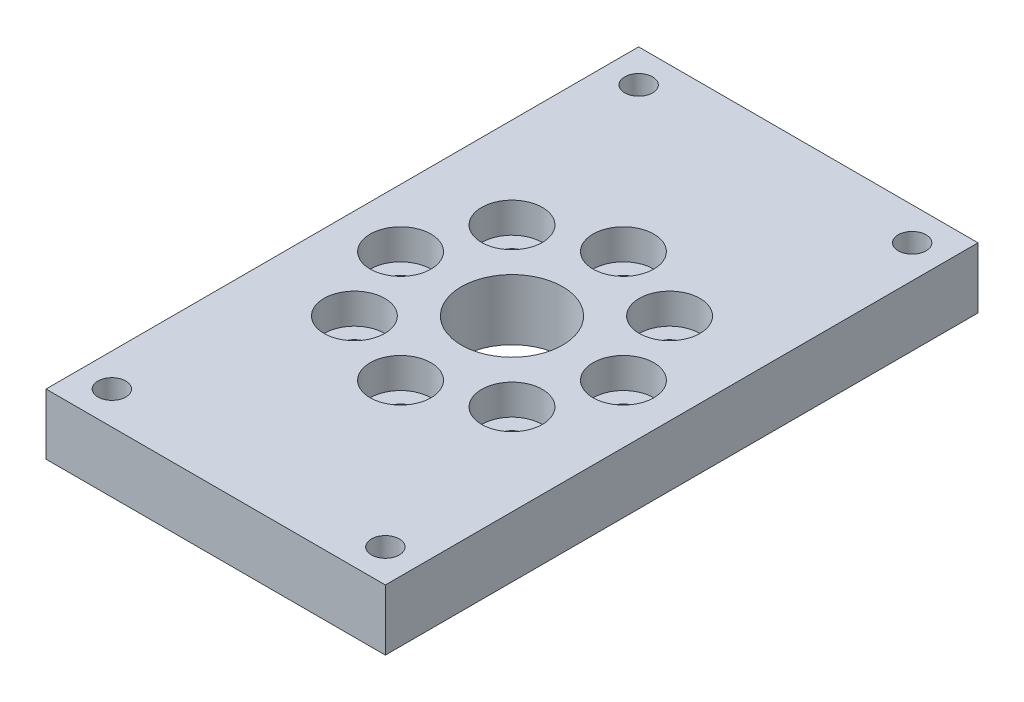
ISO-10303-21;
HEADER;
FILE_DESCRIPTION(('STEP AP214'),'2;1');
FILE_NAME('part.step','',(''),(''),'','','');
FILE_SCHEMA(('AUTOMOTIVE_DESIGN { 1 0 10303 214 1 1 1 1 }'));
ENDSEC;
DATA;
#1=APPLICATION_CONTEXT('core data for automotive mechanical design processes');
#2=APPLICATION_PROTOCOL_DEFINITION('international standard','automotive_design',2000,#1);
#3=PRODUCT_CONTEXT('',#1,'mechanical');
#4=PRODUCT('Part','Part','',(#3));
#5=PRODUCT_RELATED_PRODUCT_CATEGORY('part','',(#4));
#6=PRODUCT_DEFINITION_FORMATION('','',#4);
#7=PRODUCT_DEFINITION_CONTEXT('part definition',#1,'design');
#8=PRODUCT_DEFINITION('design','',#6,#7);
#9=PRODUCT_DEFINITION_SHAPE('','',#8);
#10=(LENGTH_UNIT() NAMED_UNIT(*) SI_UNIT(.MILLI.,.METRE.));
#11=(NAMED_UNIT(*) PLANE_ANGLE_UNIT() SI_UNIT($,.RADIAN.));
#12=(NAMED_UNIT(*) SI_UNIT($,.STERADIAN.) SOLID_ANGLE_UNIT());
#13=UNCERTAINTY_MEASURE_WITH_UNIT(LENGTH_MEASURE(1.E-05),#10,'distance_accuracy_value','');
#14=(GEOMETRIC_REPRESENTATION_CONTEXT(3) GLOBAL_UNCERTAINTY_ASSIGNED_CONTEXT((#13)) GLOBAL_UNIT_ASSIGNED_CONTEXT((#10,
#11,#12)) REPRESENTATION_CONTEXT('',''));
#15=CARTESIAN_POINT('',(0.,0.,0.));
#16=DIRECTION('',(0.,0.,1.));
#17=DIRECTION('',(1.,0.,0.));
#18=AXIS2_PLACEMENT_3D('',#15,#16,#17);
#19=CARTESIAN_POINT('',(13.5,5.99999999999995,-26.));
#20=DIRECTION('',(0.,-1.,0.));
#21=DIRECTION('',(1.,0.,0.));
#22=AXIS2_PLACEMENT_3D('',#19,#20,#21);
#23=CYLINDRICAL_SURFACE('',#22,1.375);
#24=CARTESIAN_POINT('',(13.5,5.99999999999995,-26.));
#25=DIRECTION('',(0.,1.,0.));
#26=DIRECTION('',(-1.,0.,0.));
#27=AXIS2_PLACEMENT_3D('',#24,#25,#26);
#28=CIRCLE('',#27,1.375);
#29=CARTESIAN_POINT('',(12.125,5.99999999999996,-26.));
#30=VERTEX_POINT('',#29);
#31=EDGE_CURVE('E118',#30,#30,#28,.T.);
#32=ORIENTED_EDGE('',*,*,#31,.T.);
#33=EDGE_LOOP('',(#32));
#34=FACE_BOUND('',#33,.T.);
#35=CARTESIAN_POINT('',(13.5,2.99999999999995,-26.));
#36=DIRECTION('',(0.,-1.,0.));
#37=DIRECTION('',(1.,0.,0.));
#38=AXIS2_PLACEMENT_3D('',#35,#36,#37);
#39=CIRCLE('',#38,1.375);
#40=CARTESIAN_POINT('',(14.875,2.99999999999995,-26.));
#41=VERTEX_POINT('',#40);
#42=EDGE_CURVE('E45',#41,#41,#39,.T.);
#43=ORIENTED_EDGE('',*,*,#42,.T.);
#44=EDGE_LOOP('',(#43));
#45=FACE_BOUND('',#44,.T.);
#46=ADVANCED_FACE('F41',(#34,#45),#23,.F.);
#47=CARTESIAN_POINT('',(-13.5,6.00000000000005,-26.));
#48=DIRECTION('',(0.,-1.,0.));
#49=DIRECTION('',(1.,0.,0.));
#50=AXIS2_PLACEMENT_3D('',#47,#48,#49);
#51=CYLINDRICAL_SURFACE('',#50,1.375);
#52=CARTESIAN_POINT('',(-13.5,6.00000000000005,-26.));
#53=DIRECTION('',(0.,1.,0.));
#54=DIRECTION('',(-1.,0.,0.));
#55=AXIS2_PLACEMENT_3D('',#52,#53,#54);
#56=CIRCLE('',#55,1.375);
#57=CARTESIAN_POINT('',(-14.875,6.00000000000005,-26.));
#58=VERTEX_POINT('',#57);
#59=EDGE_CURVE('E280',#58,#58,#56,.T.);
#60=ORIENTED_EDGE('',*,*,#59,.T.);
#61=EDGE_LOOP('',(#60));
#62=FACE_BOUND('',#61,.T.);
#63=CARTESIAN_POINT('',(-13.5,3.00000000000005,-26.));
#64=DIRECTION('',(0.,-1.,0.));
#65=DIRECTION('',(1.,0.,0.));
#66=AXIS2_PLACEMENT_3D('',#63,#64,#65);
#67=CIRCLE('',#66,1.375);
#68=CARTESIAN_POINT('',(-12.125,3.00000000000004,-26.));
#69=VERTEX_POINT('',#68);
#70=EDGE_CURVE('E208',#69,#69,#67,.T.);
#71=ORIENTED_EDGE('',*,*,#70,.T.);
#72=EDGE_LOOP('',(#71));
#73=FACE_BOUND('',#72,.T.);
#74=ADVANCED_FACE('F384',(#62,#73),#51,.F.);
#75=CARTESIAN_POINT('',(13.5,5.99999999999995,26.));
#76=DIRECTION('',(0.,-1.,0.));
#77=DIRECTION('',(1.,0.,0.));
#78=AXIS2_PLACEMENT_3D('',#75,#76,#77);
#79=CYLINDRICAL_SURFACE('',#78,1.375);
#80=CARTESIAN_POINT('',(13.5,5.99999999999995,26.));
#81=DIRECTION('',(0.,1.,0.));
#82=DIRECTION('',(-1.,0.,0.));
#83=AXIS2_PLACEMENT_3D('',#80,#81,#82);
#84=CIRCLE('',#83,1.375);
#85=CARTESIAN_POINT('',(12.125,5.99999999999996,26.));
#86=VERTEX_POINT('',#85);
#87=EDGE_CURVE('E276',#86,#86,#84,.T.);
#88=ORIENTED_EDGE('',*,*,#87,.T.);
#89=EDGE_LOOP('',(#88));
#90=FACE_BOUND('',#89,.T.);
#91=CARTESIAN_POINT('',(13.5,2.99999999999995,26.));
#92=DIRECTION('',(0.,-1.,0.));
#93=DIRECTION('',(1.,0.,0.));
#94=AXIS2_PLACEMENT_3D('',#91,#92,#93);
#95=CIRCLE('',#94,1.375);
#96=CARTESIAN_POINT('',(14.875,2.99999999999995,26.));
#97=VERTEX_POINT('',#96);
#98=EDGE_CURVE('E204',#97,#97,#95,.T.);
#99=ORIENTED_EDGE('',*,*,#98,.T.);
#100=EDGE_LOOP('',(#99));
#101=FACE_BOUND('',#100,.T.);
#102=ADVANCED_FACE('F390',(#90,#101),#79,.F.);
#103=CARTESIAN_POINT('',(-13.5,6.00000000000005,26.));
#104=DIRECTION('',(0.,-1.,0.));
#105=DIRECTION('',(1.,0.,0.));
#106=AXIS2_PLACEMENT_3D('',#103,#104,#105);
#107=CYLINDRICAL_SURFACE('',#106,1.375);
#108=CARTESIAN_POINT('',(-13.5,6.00000000000005,26.));
#109=DIRECTION('',(0.,1.,0.));
#110=DIRECTION('',(-1.,0.,0.));
#111=AXIS2_PLACEMENT_3D('',#108,#109,#110);
#112=CIRCLE('',#111,1.375);
#113=CARTESIAN_POINT('',(-14.875,6.00000000000005,26.));
#114=VERTEX_POINT('',#113);
#115=EDGE_CURVE('E162',#114,#114,#112,.T.);
#116=ORIENTED_EDGE('',*,*,#115,.T.);
#117=EDGE_LOOP('',(#116));
#118=FACE_BOUND('',#117,.T.);
#119=CARTESIAN_POINT('',(-13.5,3.00000000000005,26.));
#120=DIRECTION('',(0.,-1.,0.));
#121=DIRECTION('',(1.,0.,0.));
#122=AXIS2_PLACEMENT_3D('',#119,#120,#121);
#123=CIRCLE('',#122,1.375);
#124=CARTESIAN_POINT('',(-12.125,3.00000000000004,26.));
#125=VERTEX_POINT('',#124);
#126=EDGE_CURVE('E200',#125,#125,#123,.T.);
#127=ORIENTED_EDGE('',*,*,#126,.T.);
#128=EDGE_LOOP('',(#127));
#129=FACE_BOUND('',#128,.T.);
#130=ADVANCED_FACE('F426',(#118,#129),#107,.F.);
#131=CARTESIAN_POINT('',(7.77817459305207,-13.,-7.77817459305192));
#132=DIRECTION('',(0.,1.,0.));
#133=DIRECTION('',(-1.,0.,0.));
#134=AXIS2_PLACEMENT_3D('',#131,#132,#133);
#135=CYLINDRICAL_SURFACE('',#134,1.375);
#136=CARTESIAN_POINT('',(7.77817459305211,0.,-7.77817459305192));
#137=DIRECTION('',(0.,1.,0.));
#138=DIRECTION('',(-1.,0.,0.));
#139=AXIS2_PLACEMENT_3D('',#136,#137,#138);
#140=CIRCLE('',#139,1.375);
#141=CARTESIAN_POINT('',(6.40317459305211,0.,-7.77817459305192));
#142=VERTEX_POINT('',#141);
#143=EDGE_CURVE('E129',#142,#142,#140,.T.);
#144=ORIENTED_EDGE('',*,*,#143,.F.);
#145=EDGE_LOOP('',(#144));
#146=FACE_BOUND('',#145,.T.);
#147=CARTESIAN_POINT('',(7.77817459305213,2.99999999999997,-7.77817459305192));
#148=DIRECTION('',(0.,1.,0.));
#149=DIRECTION('',(-1.,0.,0.));
#150=AXIS2_PLACEMENT_3D('',#147,#148,#149);
#151=CIRCLE('',#150,1.375);
#152=CARTESIAN_POINT('',(6.40317459305212,2.99999999999998,-7.77817459305192));
#153=VERTEX_POINT('',#152);
#154=EDGE_CURVE('E196',#153,#153,#151,.F.);
#155=ORIENTED_EDGE('',*,*,#154,.F.);
#156=EDGE_LOOP('',(#155));
#157=FACE_BOUND('',#156,.T.);
#158=ADVANCED_FACE('F536',(#146,#157),#135,.F.);
#159=CARTESIAN_POINT('',(-5.04302264350436E-13,-13.,-10.9999999999995));
#160=DIRECTION('',(0.,1.,0.));
#161=DIRECTION('',(-1.,0.,0.));
#162=AXIS2_PLACEMENT_3D('',#159,#160,#161);
#163=CYLINDRICAL_SURFACE('',#162,1.37500000000069);
#164=CARTESIAN_POINT('',(-4.58913006945475E-13,0.,-10.9999999999995));
#165=DIRECTION('',(0.,1.,0.));
#166=DIRECTION('',(-1.,0.,0.));
#167=AXIS2_PLACEMENT_3D('',#164,#165,#166);
#168=CIRCLE('',#167,1.37500000000069);
#169=CARTESIAN_POINT('',(-1.37500000000115,0.,-10.9999999999995));
#170=VERTEX_POINT('',#169);
#171=EDGE_CURVE('E133',#170,#170,#168,.T.);
#172=ORIENTED_EDGE('',*,*,#171,.F.);
#173=EDGE_LOOP('',(#172));
#174=FACE_BOUND('',#173,.T.);
#175=CARTESIAN_POINT('',(-4.48438562928946E-13,3.,-10.9999999999995));
#176=DIRECTION('',(0.,1.,0.));
#177=DIRECTION('',(-1.,0.,0.));
#178=AXIS2_PLACEMENT_3D('',#175,#176,#177);
#179=CIRCLE('',#178,1.37500000000069);
#180=CARTESIAN_POINT('',(-1.37500000000113,3.00000000000001,-10.9999999999995));
#181=VERTEX_POINT('',#180);
#182=EDGE_CURVE('E192',#181,#181,#179,.F.);
#183=ORIENTED_EDGE('',*,*,#182,.F.);
#184=EDGE_LOOP('',(#183));
#185=FACE_BOUND('',#184,.T.);
#186=ADVANCED_FACE('F533',(#174,#185),#163,.F.);
#187=CARTESIAN_POINT('',(-7.77817459305239,-13.,-7.77817459305125));
#188=DIRECTION('',(0.,1.,0.));
#189=DIRECTION('',(-1.,0.,0.));
#190=AXIS2_PLACEMENT_3D('',#187,#188,#189);
#191=CYLINDRICAL_SURFACE('',#190,1.37500000000094);
#192=CARTESIAN_POINT('',(-7.77817459305235,0.,-7.77817459305125));
#193=DIRECTION('',(0.,1.,0.));
#194=DIRECTION('',(-1.,0.,0.));
#195=AXIS2_PLACEMENT_3D('',#192,#193,#194);
#196=CIRCLE('',#195,1.37500000000094);
#197=CARTESIAN_POINT('',(-9.15317459305329,0.,-7.77817459305125));
#198=VERTEX_POINT('',#197);
#199=EDGE_CURVE('E138',#198,#198,#196,.T.);
#200=ORIENTED_EDGE('',*,*,#199,.F.);
#201=EDGE_LOOP('',(#200));
#202=FACE_BOUND('',#201,.T.);
#203=CARTESIAN_POINT('',(-7.77817459305234,3.00000000000003,-7.77817459305125));
#204=DIRECTION('',(0.,1.,0.));
#205=DIRECTION('',(-1.,0.,0.));
#206=AXIS2_PLACEMENT_3D('',#203,#204,#205);
#207=CIRCLE('',#206,1.37500000000094);
#208=CARTESIAN_POINT('',(-9.15317459305328,3.00000000000003,-7.77817459305125));
#209=VERTEX_POINT('',#208);
#210=EDGE_CURVE('E188',#209,#209,#207,.F.);
#211=ORIENTED_EDGE('',*,*,#210,.F.);
#212=EDGE_LOOP('',(#211));
#213=FACE_BOUND('',#212,.T.);
#214=ADVANCED_FACE('F529',(#202,#213),#191,.F.);
#215=CARTESIAN_POINT('',(-11.0000000000001,-13.,9.0726037793587E-13));
#216=DIRECTION('',(0.,1.,0.));
#217=DIRECTION('',(-1.,0.,0.));
#218=AXIS2_PLACEMENT_3D('',#215,#216,#217);
#219=CYLINDRICAL_SURFACE('',#218,1.37500000000096);
#220=CARTESIAN_POINT('',(-11.,0.,9.07694058804864E-13));
#221=DIRECTION('',(0.,1.,0.));
#222=DIRECTION('',(-1.,0.,0.));
#223=AXIS2_PLACEMENT_3D('',#220,#221,#222);
#224=CIRCLE('',#223,1.37500000000096);
#225=CARTESIAN_POINT('',(-12.375000000001,0.,9.07694058804864E-13));
#226=VERTEX_POINT('',#225);
#227=EDGE_CURVE('E142',#226,#226,#224,.T.);
#228=ORIENTED_EDGE('',*,*,#227,.F.);
#229=EDGE_LOOP('',(#228));
#230=FACE_BOUND('',#229,.T.);
#231=CARTESIAN_POINT('',(-11.,3.00000000000004,9.0726037793587E-13));
#232=DIRECTION('',(0.,1.,0.));
#233=DIRECTION('',(-1.,0.,0.));
#234=AXIS2_PLACEMENT_3D('',#231,#232,#233);
#235=CIRCLE('',#234,1.37500000000096);
#236=CARTESIAN_POINT('',(-12.375000000001,3.00000000000005,9.0726037793587E-13));
#237=VERTEX_POINT('',#236);
#238=EDGE_CURVE('E184',#237,#237,#235,.F.);
#239=ORIENTED_EDGE('',*,*,#238,.F.);
#240=EDGE_LOOP('',(#239));
#241=FACE_BOUND('',#240,.T.);
#242=ADVANCED_FACE('F525',(#230,#241),#219,.F.);
#243=CARTESIAN_POINT('',(-7.77817459305176,-13.,7.7781745930528));
#244=DIRECTION('',(0.,1.,0.));
#245=DIRECTION('',(-1.,0.,0.));
#246=AXIS2_PLACEMENT_3D('',#243,#244,#245);
#247=CYLINDRICAL_SURFACE('',#246,1.37500000000071);
#248=CARTESIAN_POINT('',(-7.77817459305172,0.,7.7781745930528));
#249=DIRECTION('',(0.,1.,0.));
#250=DIRECTION('',(-1.,0.,0.));
#251=AXIS2_PLACEMENT_3D('',#248,#249,#250);
#252=CIRCLE('',#251,1.37500000000071);
#253=CARTESIAN_POINT('',(-9.15317459305243,0.,7.7781745930528));
#254=VERTEX_POINT('',#253);
#255=EDGE_CURVE('E146',#254,#254,#252,.T.);
#256=ORIENTED_EDGE('',*,*,#255,.F.);
#257=EDGE_LOOP('',(#256));
#258=FACE_BOUND('',#257,.T.);
#259=CARTESIAN_POINT('',(-7.77817459305171,3.00000000000003,7.7781745930528));
#260=DIRECTION('',(0.,1.,0.));
#261=DIRECTION('',(-1.,0.,0.));
#262=AXIS2_PLACEMENT_3D('',#259,#260,#261);
#263=CIRCLE('',#262,1.37500000000071);
#264=CARTESIAN_POINT('',(-9.15317459305242,3.00000000000003,7.7781745930528));
#265=VERTEX_POINT('',#264);
#266=EDGE_CURVE('E180',#265,#265,#263,.F.);
#267=ORIENTED_EDGE('',*,*,#266,.F.);
#268=EDGE_LOOP('',(#267));
#269=FACE_BOUND('',#268,.T.);
#270=ADVANCED_FACE('F528',(#258,#269),#247,.F.);
#271=CARTESIAN_POINT('',(3.91227750028394E-13,-13.,11.0000000000005));
#272=DIRECTION('',(0.,1.,0.));
#273=DIRECTION('',(-1.,0.,0.));
#274=AXIS2_PLACEMENT_3D('',#271,#272,#273);
#275=CYLINDRICAL_SURFACE('',#274,1.37500000000034);
#276=CARTESIAN_POINT('',(4.36617007433354E-13,0.,11.0000000000005));
#277=DIRECTION('',(0.,1.,0.));
#278=DIRECTION('',(-1.,0.,0.));
#279=AXIS2_PLACEMENT_3D('',#276,#277,#278);
#280=CIRCLE('',#279,1.37500000000034);
#281=CARTESIAN_POINT('',(-1.37499999999991,0.,11.0000000000005));
#282=VERTEX_POINT('',#281);
#283=EDGE_CURVE('E150',#282,#282,#280,.T.);
#284=ORIENTED_EDGE('',*,*,#283,.F.);
#285=EDGE_LOOP('',(#284));
#286=FACE_BOUND('',#285,.T.);
#287=CARTESIAN_POINT('',(4.47091451449884E-13,3.,11.0000000000005));
#288=DIRECTION('',(0.,1.,0.));
#289=DIRECTION('',(-1.,0.,0.));
#290=AXIS2_PLACEMENT_3D('',#287,#288,#289);
#291=CIRCLE('',#290,1.37500000000034);
#292=CARTESIAN_POINT('',(-1.3749999999999,3.00000000000001,11.0000000000005));
#293=VERTEX_POINT('',#292);
#294=EDGE_CURVE('E176',#293,#293,#291,.F.);
#295=ORIENTED_EDGE('',*,*,#294,.F.);
#296=EDGE_LOOP('',(#295));
#297=FACE_BOUND('',#296,.T.);
#298=ADVANCED_FACE('F541',(#286,#297),#275,.F.);
#299=CARTESIAN_POINT('',(7.77817459305194,-13.,7.77817459305205));
#300=DIRECTION('',(0.,1.,0.));
#301=DIRECTION('',(-1.,0.,0.));
#302=AXIS2_PLACEMENT_3D('',#299,#300,#301);
#303=CYLINDRICAL_SURFACE('',#302,1.375);
#304=CARTESIAN_POINT('',(7.77817459305199,0.,7.77817459305205));
#305=DIRECTION('',(0.,1.,0.));
#306=DIRECTION('',(-1.,0.,0.));
#307=AXIS2_PLACEMENT_3D('',#304,#305,#306);
#308=CIRCLE('',#307,1.375);
#309=CARTESIAN_POINT('',(6.40317459305199,0.,7.77817459305205));
#310=VERTEX_POINT('',#309);
#311=EDGE_CURVE('E154',#310,#310,#308,.T.);
#312=ORIENTED_EDGE('',*,*,#311,.F.);
#313=EDGE_LOOP('',(#312));
#314=FACE_BOUND('',#313,.T.);
#315=CARTESIAN_POINT('',(7.778174593052,2.99999999999997,7.77817459305205));
#316=DIRECTION('',(0.,1.,0.));
#317=DIRECTION('',(-1.,0.,0.));
#318=AXIS2_PLACEMENT_3D('',#315,#316,#317);
#319=CIRCLE('',#318,1.375);
#320=CARTESIAN_POINT('',(6.403174593052,2.99999999999998,7.77817459305205));
#321=VERTEX_POINT('',#320);
#322=EDGE_CURVE('E171',#321,#321,#319,.F.);
#323=ORIENTED_EDGE('',*,*,#322,.F.);
#324=EDGE_LOOP('',(#323));
#325=FACE_BOUND('',#324,.T.);
#326=ADVANCED_FACE('F401',(#314,#325),#303,.F.);
#327=CARTESIAN_POINT('',(10.9999999999999,-13.,0.));
#328=DIRECTION('',(0.,1.,0.));
#329=DIRECTION('',(-1.,0.,0.));
#330=AXIS2_PLACEMENT_3D('',#327,#328,#329);
#331=CYLINDRICAL_SURFACE('',#330,1.375);
#332=CARTESIAN_POINT('',(11.,0.,0.));
#333=DIRECTION('',(0.,1.,0.));
#334=DIRECTION('',(-1.,0.,0.));
#335=AXIS2_PLACEMENT_3D('',#332,#333,#334);
#336=CIRCLE('',#335,1.375);
#337=CARTESIAN_POINT('',(9.62499999999999,0.,0.));
#338=VERTEX_POINT('',#337);
#339=EDGE_CURVE('E158',#338,#338,#336,.T.);
#340=ORIENTED_EDGE('',*,*,#339,.F.);
#341=EDGE_LOOP('',(#340));
#342=FACE_BOUND('',#341,.T.);
#343=CARTESIAN_POINT('',(11.,2.99999999999996,0.));
#344=DIRECTION('',(0.,1.,0.));
#345=DIRECTION('',(-1.,0.,0.));
#346=AXIS2_PLACEMENT_3D('',#343,#344,#345);
#347=CIRCLE('',#346,1.375);
#348=CARTESIAN_POINT('',(9.625,2.99999999999997,0.));
#349=VERTEX_POINT('',#348);
#350=EDGE_CURVE('E167',#349,#349,#347,.F.);
#351=ORIENTED_EDGE('',*,*,#350,.F.);
#352=EDGE_LOOP('',(#351));
#353=FACE_BOUND('',#352,.T.);
#354=ADVANCED_FACE('F396',(#342,#353),#331,.F.);
#355=CARTESIAN_POINT('',(0.,6.,0.));
#356=DIRECTION('',(0.,1.,0.));
#357=DIRECTION('',(-1.,0.,0.));
#358=AXIS2_PLACEMENT_3D('',#355,#356,#357);
#359=PLANE('',#358);
#360=CARTESIAN_POINT('',(11.0000000000003,5.99999999999996,0.));
#361=DIRECTION('',(0.,1.,0.));
#362=DIRECTION('',(-1.,0.,0.));
#363=AXIS2_PLACEMENT_3D('',#360,#361,#362);
#364=CIRCLE('',#363,3.00000000000029);
#365=CARTESIAN_POINT('',(8.00000000000004,5.99999999999997,0.));
#366=VERTEX_POINT('',#365);
#367=EDGE_CURVE('E235',#366,#366,#364,.T.);
#368=ORIENTED_EDGE('',*,*,#367,.F.);
#369=EDGE_LOOP('',(#368));
#370=FACE_BOUND('',#369,.T.);
#371=CARTESIAN_POINT('',(7.77817459305259,5.99999999999997,7.77817459305213));
#372=DIRECTION('',(0.,1.,0.));
#373=DIRECTION('',(-1.,0.,0.));
#374=AXIS2_PLACEMENT_3D('',#371,#372,#373);
#375=CIRCLE('',#374,3.00000000000067);
#376=CARTESIAN_POINT('',(4.77817459305192,5.99999999999998,7.77817459305213));
#377=VERTEX_POINT('',#376);
#378=EDGE_CURVE('E243',#377,#377,#375,.T.);
#379=ORIENTED_EDGE('',*,*,#378,.F.);
#380=EDGE_LOOP('',(#379));
#381=FACE_BOUND('',#380,.T.);
#382=CARTESIAN_POINT('',(6.6108964850849E-13,6.,11.0000000000003));
#383=DIRECTION('',(0.,1.,0.));
#384=DIRECTION('',(-1.,0.,0.));
#385=AXIS2_PLACEMENT_3D('',#382,#383,#384);
#386=CIRCLE('',#385,3.00000000000091);
#387=CARTESIAN_POINT('',(-3.00000000000025,6.00000000000001,11.0000000000003));
#388=VERTEX_POINT('',#387);
#389=EDGE_CURVE('E251',#388,#388,#386,.T.);
#390=ORIENTED_EDGE('',*,*,#389,.F.);
#391=EDGE_LOOP('',(#390));
#392=FACE_BOUND('',#391,.T.);
#393=CARTESIAN_POINT('',(-7.77817459305145,6.00000000000003,7.77817459305258));
#394=DIRECTION('',(0.,1.,0.));
#395=DIRECTION('',(-1.,0.,0.));
#396=AXIS2_PLACEMENT_3D('',#393,#394,#395);
#397=CIRCLE('',#396,3.00000000000089);
#398=CARTESIAN_POINT('',(-10.7781745930523,6.00000000000004,7.77817459305258));
#399=VERTEX_POINT('',#398);
#400=EDGE_CURVE('E259',#399,#399,#397,.T.);
#401=ORIENTED_EDGE('',*,*,#400,.F.);
#402=EDGE_LOOP('',(#401));
#403=FACE_BOUND('',#402,.T.);
#404=CARTESIAN_POINT('',(-10.9999999999997,6.00000000000004,6.51388665229291E-13));
#405=DIRECTION('',(0.,1.,0.));
#406=DIRECTION('',(-1.,0.,0.));
#407=AXIS2_PLACEMENT_3D('',#404,#405,#406);
#408=CIRCLE('',#407,3.00000000000064);
#409=CARTESIAN_POINT('',(-14.0000000000003,6.00000000000005,6.51388665229291E-13));
#410=VERTEX_POINT('',#409);
#411=EDGE_CURVE('E290',#410,#410,#408,.T.);
#412=ORIENTED_EDGE('',*,*,#411,.F.);
#413=EDGE_LOOP('',(#412));
#414=FACE_BOUND('',#413,.T.);
#415=CARTESIAN_POINT('',(-7.77817459305191,6.00000000000003,-7.77817459305146));
#416=DIRECTION('',(0.,1.,0.));
#417=DIRECTION('',(-1.,0.,0.));
#418=AXIS2_PLACEMENT_3D('',#415,#416,#417);
#419=CIRCLE('',#418,3.0000000000003);
#420=CARTESIAN_POINT('',(-10.7781745930522,6.00000000000004,-7.77817459305146));
#421=VERTEX_POINT('',#420);
#422=EDGE_CURVE('E226',#421,#421,#419,.T.);
#423=ORIENTED_EDGE('',*,*,#422,.F.);
#424=EDGE_LOOP('',(#423));
#425=FACE_BOUND('',#424,.T.);
#426=CARTESIAN_POINT('',(0.,6.,-10.9999999999997));
#427=DIRECTION('',(0.,1.,0.));
#428=DIRECTION('',(-1.,0.,0.));
#429=AXIS2_PLACEMENT_3D('',#426,#427,#428);
#430=CIRCLE('',#429,3.00000000000009);
#431=CARTESIAN_POINT('',(-3.00000000000007,6.00000000000001,-10.9999999999997));
#432=VERTEX_POINT('',#431);
#433=EDGE_CURVE('E215',#432,#432,#430,.T.);
#434=ORIENTED_EDGE('',*,*,#433,.F.);
#435=EDGE_LOOP('',(#434));
#436=FACE_BOUND('',#435,.T.);
#437=CARTESIAN_POINT('',(7.77817459305214,5.99999999999997,-7.77817459305192));
#438=DIRECTION('',(0.,1.,0.));
#439=DIRECTION('',(-1.,0.,0.));
#440=AXIS2_PLACEMENT_3D('',#437,#438,#439);
#441=CIRCLE('',#440,3.);
#442=CARTESIAN_POINT('',(4.77817459305213,5.99999999999998,-7.77817459305192));
#443=VERTEX_POINT('',#442);
#444=EDGE_CURVE('E234',#443,#443,#441,.T.);
#445=ORIENTED_EDGE('',*,*,#444,.F.);
#446=EDGE_LOOP('',(#445));
#447=FACE_BOUND('',#446,.T.);
#448=CARTESIAN_POINT('',(0.,6.,0.));
#449=DIRECTION('',(0.,1.,0.));
#450=DIRECTION('',(-1.,0.,0.));
#451=AXIS2_PLACEMENT_3D('',#448,#449,#450);
#452=CIRCLE('',#451,5.);
#453=CARTESIAN_POINT('',(-4.99999999999999,6.00000000000002,0.));
#454=VERTEX_POINT('',#453);
#455=EDGE_CURVE('E166',#454,#454,#452,.T.);
#456=ORIENTED_EDGE('',*,*,#455,.F.);
#457=EDGE_LOOP('',(#456));
#458=FACE_BOUND('',#457,.T.);
#459=ORIENTED_EDGE('',*,*,#87,.F.);
#460=EDGE_LOOP('',(#459));
#461=FACE_BOUND('',#460,.T.);
#462=ORIENTED_EDGE('',*,*,#31,.F.);
#463=EDGE_LOOP('',(#462));
#464=FACE_BOUND('',#463,.T.);
#465=DIRECTION('',(-1.,0.,0.));
#466=VECTOR('',#465,1.);
#467=CARTESIAN_POINT('',(-16.75,6.00000000000006,-29.25));
#468=LINE('',#467,#466);
#469=CARTESIAN_POINT('',(16.75,5.99999999999994,-29.25));
#470=VERTEX_POINT('',#469);
#471=CARTESIAN_POINT('',(-16.75,6.00000000000006,-29.25));
#472=VERTEX_POINT('',#471);
#473=EDGE_CURVE('E97',#470,#472,#468,.T.);
#474=ORIENTED_EDGE('',*,*,#473,.T.);
#475=DIRECTION('',(0.,0.,1.));
#476=VECTOR('',#475,1.);
#477=CARTESIAN_POINT('',(-16.75,6.00000000000006,29.25));
#478=LINE('',#477,#476);
#479=CARTESIAN_POINT('',(-16.75,6.00000000000006,29.25));
#480=VERTEX_POINT('',#479);
#481=EDGE_CURVE('E91',#472,#480,#478,.T.);
#482=ORIENTED_EDGE('',*,*,#481,.T.);
#483=DIRECTION('',(1.,0.,0.));
#484=VECTOR('',#483,1.);
#485=CARTESIAN_POINT('',(-16.75,6.00000000000006,29.25));
#486=LINE('',#485,#484);
#487=CARTESIAN_POINT('',(16.75,5.99999999999994,29.25));
#488=VERTEX_POINT('',#487);
#489=EDGE_CURVE('E95',#480,#488,#486,.T.);
#490=ORIENTED_EDGE('',*,*,#489,.T.);
#491=DIRECTION('',(0.,0.,-1.));
#492=VECTOR('',#491,1.);
#493=CARTESIAN_POINT('',(16.75,5.99999999999994,29.25));
#494=LINE('',#493,#492);
#495=EDGE_CURVE('E61',#488,#470,#494,.T.);
#496=ORIENTED_EDGE('',*,*,#495,.T.);
#497=EDGE_LOOP('',(#474,#482,#490,#496));
#498=FACE_BOUND('',#497,.T.);
#499=ORIENTED_EDGE('',*,*,#59,.F.);
#500=EDGE_LOOP('',(#499));
#501=FACE_BOUND('',#500,.T.);
#502=ORIENTED_EDGE('',*,*,#115,.F.);
#503=EDGE_LOOP('',(#502));
#504=FACE_BOUND('',#503,.T.);
#505=ADVANCED_FACE('F92',(#370,#381,#392,#403,#414,#425,#436,#447,#458,#461,#464,#498,#501,
#504),#359,.T.);
#506=CARTESIAN_POINT('',(0.,0.,0.));
#507=DIRECTION('',(0.,1.,0.));
#508=DIRECTION('',(-1.,0.,0.));
#509=AXIS2_PLACEMENT_3D('',#506,#507,#508);
#510=PLANE('',#509);
#511=CARTESIAN_POINT('',(13.5,0.,-26.));
#512=DIRECTION('',(0.,-1.,0.));
#513=DIRECTION('',(1.,0.,0.));
#514=AXIS2_PLACEMENT_3D('',#511,#512,#513);
#515=CIRCLE('',#514,3.);
#516=CARTESIAN_POINT('',(16.5,0.,-26.));
#517=VERTEX_POINT('',#516);
#518=EDGE_CURVE('E311',#517,#517,#515,.T.);
#519=ORIENTED_EDGE('',*,*,#518,.F.);
#520=EDGE_LOOP('',(#519));
#521=FACE_BOUND('',#520,.T.);
#522=CARTESIAN_POINT('',(13.5,0.,26.));
#523=DIRECTION('',(0.,-1.,0.));
#524=DIRECTION('',(1.,0.,0.));
#525=AXIS2_PLACEMENT_3D('',#522,#523,#524);
#526=CIRCLE('',#525,3.);
#527=CARTESIAN_POINT('',(16.5,0.,26.));
#528=VERTEX_POINT('',#527);
#529=EDGE_CURVE('E319',#528,#528,#526,.T.);
#530=ORIENTED_EDGE('',*,*,#529,.F.);
#531=EDGE_LOOP('',(#530));
#532=FACE_BOUND('',#531,.T.);
#533=CARTESIAN_POINT('',(-13.5,0.,26.));
#534=DIRECTION('',(0.,-1.,0.));
#535=DIRECTION('',(1.,0.,0.));
#536=AXIS2_PLACEMENT_3D('',#533,#534,#535);
#537=CIRCLE('',#536,3.);
#538=CARTESIAN_POINT('',(-10.5,0.,26.));
#539=VERTEX_POINT('',#538);
#540=EDGE_CURVE('E327',#539,#539,#537,.T.);
#541=ORIENTED_EDGE('',*,*,#540,.F.);
#542=EDGE_LOOP('',(#541));
#543=FACE_BOUND('',#542,.T.);
#544=CARTESIAN_POINT('',(-13.5,0.,-26.));
#545=DIRECTION('',(0.,-1.,0.));
#546=DIRECTION('',(1.,0.,0.));
#547=AXIS2_PLACEMENT_3D('',#544,#545,#546);
#548=CIRCLE('',#547,3.);
#549=CARTESIAN_POINT('',(-10.5,0.,-26.));
#550=VERTEX_POINT('',#549);
#551=EDGE_CURVE('E303',#550,#550,#548,.T.);
#552=ORIENTED_EDGE('',*,*,#551,.F.);
#553=EDGE_LOOP('',(#552));
#554=FACE_BOUND('',#553,.T.);
#555=CARTESIAN_POINT('',(0.,0.,0.));
#556=DIRECTION('',(0.,1.,0.));
#557=DIRECTION('',(-1.,0.,0.));
#558=AXIS2_PLACEMENT_3D('',#555,#556,#557);
#559=CIRCLE('',#558,5.);
#560=CARTESIAN_POINT('',(-5.00000000000001,0.,0.));
#561=VERTEX_POINT('',#560);
#562=EDGE_CURVE('E134',#561,#561,#559,.T.);
#563=ORIENTED_EDGE('',*,*,#562,.T.);
#564=EDGE_LOOP('',(#563));
#565=FACE_BOUND('',#564,.T.);
#566=ORIENTED_EDGE('',*,*,#339,.T.);
#567=EDGE_LOOP('',(#566));
#568=FACE_BOUND('',#567,.T.);
#569=ORIENTED_EDGE('',*,*,#311,.T.);
#570=EDGE_LOOP('',(#569));
#571=FACE_BOUND('',#570,.T.);
#572=ORIENTED_EDGE('',*,*,#283,.T.);
#573=EDGE_LOOP('',(#572));
#574=FACE_BOUND('',#573,.T.);
#575=ORIENTED_EDGE('',*,*,#255,.T.);
#576=EDGE_LOOP('',(#575));
#577=FACE_BOUND('',#576,.T.);
#578=ORIENTED_EDGE('',*,*,#227,.T.);
#579=EDGE_LOOP('',(#578));
#580=FACE_BOUND('',#579,.T.);
#581=ORIENTED_EDGE('',*,*,#199,.T.);
#582=EDGE_LOOP('',(#581));
#583=FACE_BOUND('',#582,.T.);
#584=ORIENTED_EDGE('',*,*,#171,.T.);
#585=EDGE_LOOP('',(#584));
#586=FACE_BOUND('',#585,.T.);
#587=ORIENTED_EDGE('',*,*,#143,.T.);
#588=EDGE_LOOP('',(#587));
#589=FACE_BOUND('',#588,.T.);
#590=DIRECTION('',(-1.,0.,0.));
#591=VECTOR('',#590,1.);
#592=CARTESIAN_POINT('',(-16.75,0.,-29.25));
#593=LINE('',#592,#591);
#594=CARTESIAN_POINT('',(16.75,0.,-29.25));
#595=VERTEX_POINT('',#594);
#596=CARTESIAN_POINT('',(-16.75,0.,-29.25));
#597=VERTEX_POINT('',#596);
#598=EDGE_CURVE('E114',#595,#597,#593,.T.);
#599=ORIENTED_EDGE('',*,*,#598,.F.);
#600=DIRECTION('',(0.,0.,-1.));
#601=VECTOR('',#600,1.);
#602=CARTESIAN_POINT('',(16.75,0.,29.25));
#603=LINE('',#602,#601);
#604=CARTESIAN_POINT('',(16.75,0.,29.25));
#605=VERTEX_POINT('',#604);
#606=EDGE_CURVE('E84',#605,#595,#603,.T.);
#607=ORIENTED_EDGE('',*,*,#606,.F.);
#608=DIRECTION('',(1.,0.,0.));
#609=VECTOR('',#608,1.);
#610=CARTESIAN_POINT('',(-16.75,0.,29.25));
#611=LINE('',#610,#609);
#612=CARTESIAN_POINT('',(-16.75,0.,29.25));
#613=VERTEX_POINT('',#612);
#614=EDGE_CURVE('E78',#613,#605,#611,.T.);
#615=ORIENTED_EDGE('',*,*,#614,.F.);
#616=DIRECTION('',(0.,0.,1.));
#617=VECTOR('',#616,1.);
#618=CARTESIAN_POINT('',(-16.75,0.,29.25));
#619=LINE('',#618,#617);
#620=EDGE_CURVE('E102',#597,#613,#619,.T.);
#621=ORIENTED_EDGE('',*,*,#620,.F.);
#622=EDGE_LOOP('',(#599,#607,#615,#621));
#623=FACE_BOUND('',#622,.T.);
#624=ADVANCED_FACE('F344',(#521,#532,#543,#554,#565,#568,#571,#574,#577,#580,#583,#586,#589,
#623),#510,.F.);
#625=CARTESIAN_POINT('',(-16.75,6.00000000000006,-29.25));
#626=DIRECTION('',(0.,0.,1.));
#627=DIRECTION('',(1.,0.,0.));
#628=AXIS2_PLACEMENT_3D('',#625,#626,#627);
#629=PLANE('',#628);
#630=ORIENTED_EDGE('',*,*,#598,.T.);
#631=DIRECTION('',(0.,-1.,0.));
#632=VECTOR('',#631,1.);
#633=CARTESIAN_POINT('',(-16.75,6.00000000000006,-29.25));
#634=LINE('',#633,#632);
#635=EDGE_CURVE('E11',#472,#597,#634,.T.);
#636=ORIENTED_EDGE('',*,*,#635,.F.);
#637=ORIENTED_EDGE('',*,*,#473,.F.);
#638=DIRECTION('',(0.,-1.,0.));
#639=VECTOR('',#638,1.);
#640=CARTESIAN_POINT('',(16.75,5.99999999999994,-29.25));
#641=LINE('',#640,#639);
#642=EDGE_CURVE('E110',#470,#595,#641,.T.);
#643=ORIENTED_EDGE('',*,*,#642,.T.);
#644=EDGE_LOOP('',(#630,#636,#637,#643));
#645=FACE_BOUND('',#644,.T.);
#646=ADVANCED_FACE('F43',(#645),#629,.F.);
#647=CARTESIAN_POINT('',(-16.75,6.00000000000006,29.25));
#648=DIRECTION('',(1.,0.,0.));
#649=DIRECTION('',(0.,0.,-1.));
#650=AXIS2_PLACEMENT_3D('',#647,#648,#649);
#651=PLANE('',#650);
#652=ORIENTED_EDGE('',*,*,#620,.T.);
#653=DIRECTION('',(0.,-1.,0.));
#654=VECTOR('',#653,1.);
#655=CARTESIAN_POINT('',(-16.75,6.00000000000006,29.25));
#656=LINE('',#655,#654);
#657=EDGE_CURVE('E52',#480,#613,#656,.T.);
#658=ORIENTED_EDGE('',*,*,#657,.F.);
#659=ORIENTED_EDGE('',*,*,#481,.F.);
#660=ORIENTED_EDGE('',*,*,#635,.T.);
#661=EDGE_LOOP('',(#652,#658,#659,#660));
#662=FACE_BOUND('',#661,.T.);
#663=ADVANCED_FACE('F101',(#662),#651,.F.);
#664=CARTESIAN_POINT('',(-16.75,6.00000000000006,29.25));
#665=DIRECTION('',(0.,0.,-1.));
#666=DIRECTION('',(-1.,0.,0.));
#667=AXIS2_PLACEMENT_3D('',#664,#665,#666);
#668=PLANE('',#667);
#669=ORIENTED_EDGE('',*,*,#614,.T.);
#670=DIRECTION('',(0.,-1.,0.));
#671=VECTOR('',#670,1.);
#672=CARTESIAN_POINT('',(16.75,5.99999999999994,29.25));
#673=LINE('',#672,#671);
#674=EDGE_CURVE('E104',#488,#605,#673,.T.);
#675=ORIENTED_EDGE('',*,*,#674,.F.);
#676=ORIENTED_EDGE('',*,*,#489,.F.);
#677=ORIENTED_EDGE('',*,*,#657,.T.);
#678=EDGE_LOOP('',(#669,#675,#676,#677));
#679=FACE_BOUND('',#678,.T.);
#680=ADVANCED_FACE('F106',(#679),#668,.F.);
#681=CARTESIAN_POINT('',(16.75,5.99999999999994,29.25));
#682=DIRECTION('',(-1.,0.,0.));
#683=DIRECTION('',(0.,0.,1.));
#684=AXIS2_PLACEMENT_3D('',#681,#682,#683);
#685=PLANE('',#684);
#686=ORIENTED_EDGE('',*,*,#606,.T.);
#687=ORIENTED_EDGE('',*,*,#642,.F.);
#688=ORIENTED_EDGE('',*,*,#495,.F.);
#689=ORIENTED_EDGE('',*,*,#674,.T.);
#690=EDGE_LOOP('',(#686,#687,#688,#689));
#691=FACE_BOUND('',#690,.T.);
#692=ADVANCED_FACE('F371',(#691),#685,.F.);
#693=CARTESIAN_POINT('',(0.,-13.,0.));
#694=DIRECTION('',(0.,1.,0.));
#695=DIRECTION('',(-1.,0.,0.));
#696=AXIS2_PLACEMENT_3D('',#693,#694,#695);
#697=CYLINDRICAL_SURFACE('',#696,5.);
#698=ORIENTED_EDGE('',*,*,#455,.T.);
#699=EDGE_LOOP('',(#698));
#700=FACE_BOUND('',#699,.T.);
#701=ORIENTED_EDGE('',*,*,#562,.F.);
#702=EDGE_LOOP('',(#701));
#703=FACE_BOUND('',#702,.T.);
#704=ADVANCED_FACE('F373',(#700,#703),#697,.F.);
#705=CARTESIAN_POINT('',(11.0000000000003,2.99999999999996,0.));
#706=DIRECTION('',(0.,1.,0.));
#707=DIRECTION('',(-1.,0.,0.));
#708=AXIS2_PLACEMENT_3D('',#705,#706,#707);
#709=PLANE('',#708);
#710=CARTESIAN_POINT('',(11.0000000000003,2.99999999999996,0.));
#711=DIRECTION('',(0.,1.,0.));
#712=DIRECTION('',(-1.,0.,0.));
#713=AXIS2_PLACEMENT_3D('',#710,#711,#712);
#714=CIRCLE('',#713,3.00000000000029);
#715=CARTESIAN_POINT('',(8.00000000000004,2.99999999999997,0.));
#716=VERTEX_POINT('',#715);
#717=EDGE_CURVE('E230',#716,#716,#714,.T.);
#718=ORIENTED_EDGE('',*,*,#717,.T.);
#719=EDGE_LOOP('',(#718));
#720=FACE_BOUND('',#719,.T.);
#721=ORIENTED_EDGE('',*,*,#350,.T.);
#722=EDGE_LOOP('',(#721));
#723=FACE_BOUND('',#722,.T.);
#724=ADVANCED_FACE('F379',(#720,#723),#709,.T.);
#725=CARTESIAN_POINT('',(11.0000000000003,2.99999999999996,0.));
#726=DIRECTION('',(0.,1.,0.));
#727=DIRECTION('',(-1.,0.,0.));
#728=AXIS2_PLACEMENT_3D('',#725,#726,#727);
#729=CYLINDRICAL_SURFACE('',#728,3.00000000000029);
#730=ORIENTED_EDGE('',*,*,#717,.F.);
#731=EDGE_LOOP('',(#730));
#732=FACE_BOUND('',#731,.T.);
#733=ORIENTED_EDGE('',*,*,#367,.T.);
#734=EDGE_LOOP('',(#733));
#735=FACE_BOUND('',#734,.T.);
#736=ADVANCED_FACE('F491',(#732,#735),#729,.F.);
#737=CARTESIAN_POINT('',(7.77817459305258,2.99999999999997,7.77817459305213));
#738=DIRECTION('',(0.,1.,0.));
#739=DIRECTION('',(-1.,0.,0.));
#740=AXIS2_PLACEMENT_3D('',#737,#738,#739);
#741=PLANE('',#740);
#742=CARTESIAN_POINT('',(7.77817459305258,2.99999999999997,7.77817459305213));
#743=DIRECTION('',(0.,1.,0.));
#744=DIRECTION('',(-1.,0.,0.));
#745=AXIS2_PLACEMENT_3D('',#742,#743,#744);
#746=CIRCLE('',#745,3.00000000000067);
#747=CARTESIAN_POINT('',(4.77817459305191,2.99999999999998,7.77817459305213));
#748=VERTEX_POINT('',#747);
#749=EDGE_CURVE('E239',#748,#748,#746,.T.);
#750=ORIENTED_EDGE('',*,*,#749,.T.);
#751=EDGE_LOOP('',(#750));
#752=FACE_BOUND('',#751,.T.);
#753=ORIENTED_EDGE('',*,*,#322,.T.);
#754=EDGE_LOOP('',(#753));
#755=FACE_BOUND('',#754,.T.);
#756=ADVANCED_FACE('F495',(#752,#755),#741,.T.);
#757=CARTESIAN_POINT('',(7.77817459305258,2.99999999999997,7.77817459305213));
#758=DIRECTION('',(0.,1.,0.));
#759=DIRECTION('',(-1.,0.,0.));
#760=AXIS2_PLACEMENT_3D('',#757,#758,#759);
#761=CYLINDRICAL_SURFACE('',#760,3.00000000000067);
#762=ORIENTED_EDGE('',*,*,#749,.F.);
#763=EDGE_LOOP('',(#762));
#764=FACE_BOUND('',#763,.T.);
#765=ORIENTED_EDGE('',*,*,#378,.T.);
#766=EDGE_LOOP('',(#765));
#767=FACE_BOUND('',#766,.T.);
#768=ADVANCED_FACE('F499',(#764,#767),#761,.F.);
#769=CARTESIAN_POINT('',(6.50615204491961E-13,3.,11.0000000000003));
#770=DIRECTION('',(0.,1.,0.));
#771=DIRECTION('',(-1.,0.,0.));
#772=AXIS2_PLACEMENT_3D('',#769,#770,#771);
#773=PLANE('',#772);
#774=CARTESIAN_POINT('',(6.50615204491961E-13,3.,11.0000000000003));
#775=DIRECTION('',(0.,1.,0.));
#776=DIRECTION('',(-1.,0.,0.));
#777=AXIS2_PLACEMENT_3D('',#774,#775,#776);
#778=CIRCLE('',#777,3.00000000000091);
#779=CARTESIAN_POINT('',(-3.00000000000026,3.00000000000001,11.0000000000003));
#780=VERTEX_POINT('',#779);
#781=EDGE_CURVE('E247',#780,#780,#778,.T.);
#782=ORIENTED_EDGE('',*,*,#781,.T.);
#783=EDGE_LOOP('',(#782));
#784=FACE_BOUND('',#783,.T.);
#785=ORIENTED_EDGE('',*,*,#294,.T.);
#786=EDGE_LOOP('',(#785));
#787=FACE_BOUND('',#786,.T.);
#788=ADVANCED_FACE('F503',(#784,#787),#773,.T.);
#789=CARTESIAN_POINT('',(6.50615204491961E-13,3.,11.0000000000003));
#790=DIRECTION('',(0.,1.,0.));
#791=DIRECTION('',(-1.,0.,0.));
#792=AXIS2_PLACEMENT_3D('',#789,#790,#791);
#793=CYLINDRICAL_SURFACE('',#792,3.00000000000091);
#794=ORIENTED_EDGE('',*,*,#781,.F.);
#795=EDGE_LOOP('',(#794));
#796=FACE_BOUND('',#795,.T.);
#797=ORIENTED_EDGE('',*,*,#389,.T.);
#798=EDGE_LOOP('',(#797));
#799=FACE_BOUND('',#798,.T.);
#800=ADVANCED_FACE('F507',(#796,#799),#793,.F.);
#801=CARTESIAN_POINT('',(-7.77817459305147,3.00000000000003,7.77817459305258));
#802=DIRECTION('',(0.,1.,0.));
#803=DIRECTION('',(-1.,0.,0.));
#804=AXIS2_PLACEMENT_3D('',#801,#802,#803);
#805=PLANE('',#804);
#806=CARTESIAN_POINT('',(-7.77817459305147,3.00000000000003,7.77817459305258));
#807=DIRECTION('',(0.,1.,0.));
#808=DIRECTION('',(-1.,0.,0.));
#809=AXIS2_PLACEMENT_3D('',#806,#807,#808);
#810=CIRCLE('',#809,3.00000000000089);
#811=CARTESIAN_POINT('',(-10.7781745930524,3.00000000000004,7.77817459305258));
#812=VERTEX_POINT('',#811);
#813=EDGE_CURVE('E255',#812,#812,#810,.T.);
#814=ORIENTED_EDGE('',*,*,#813,.T.);
#815=EDGE_LOOP('',(#814));
#816=FACE_BOUND('',#815,.T.);
#817=ORIENTED_EDGE('',*,*,#266,.T.);
#818=EDGE_LOOP('',(#817));
#819=FACE_BOUND('',#818,.T.);
#820=ADVANCED_FACE('F511',(#816,#819),#805,.T.);
#821=CARTESIAN_POINT('',(-7.77817459305147,3.00000000000003,7.77817459305258));
#822=DIRECTION('',(0.,1.,0.));
#823=DIRECTION('',(-1.,0.,0.));
#824=AXIS2_PLACEMENT_3D('',#821,#822,#823);
#825=CYLINDRICAL_SURFACE('',#824,3.00000000000089);
#826=ORIENTED_EDGE('',*,*,#813,.F.);
#827=EDGE_LOOP('',(#826));
#828=FACE_BOUND('',#827,.T.);
#829=ORIENTED_EDGE('',*,*,#400,.T.);
#830=EDGE_LOOP('',(#829));
#831=FACE_BOUND('',#830,.T.);
#832=ADVANCED_FACE('F467',(#828,#831),#825,.F.);
#833=CARTESIAN_POINT('',(-10.9999999999997,3.00000000000004,6.51388665229291E-13));
#834=DIRECTION('',(0.,1.,0.));
#835=DIRECTION('',(-1.,0.,0.));
#836=AXIS2_PLACEMENT_3D('',#833,#834,#835);
#837=PLANE('',#836);
#838=CARTESIAN_POINT('',(-10.9999999999997,3.00000000000004,6.51388665229291E-13));
#839=DIRECTION('',(0.,1.,0.));
#840=DIRECTION('',(-1.,0.,0.));
#841=AXIS2_PLACEMENT_3D('',#838,#839,#840);
#842=CIRCLE('',#841,3.00000000000064);
#843=CARTESIAN_POINT('',(-14.0000000000003,3.00000000000005,6.51388665229291E-13));
#844=VERTEX_POINT('',#843);
#845=EDGE_CURVE('E263',#844,#844,#842,.T.);
#846=ORIENTED_EDGE('',*,*,#845,.T.);
#847=EDGE_LOOP('',(#846));
#848=FACE_BOUND('',#847,.T.);
#849=ORIENTED_EDGE('',*,*,#238,.T.);
#850=EDGE_LOOP('',(#849));
#851=FACE_BOUND('',#850,.T.);
#852=ADVANCED_FACE('F463',(#848,#851),#837,.T.);
#853=CARTESIAN_POINT('',(-10.9999999999997,3.00000000000004,6.51388665229291E-13));
#854=DIRECTION('',(0.,1.,0.));
#855=DIRECTION('',(-1.,0.,0.));
#856=AXIS2_PLACEMENT_3D('',#853,#854,#855);
#857=CYLINDRICAL_SURFACE('',#856,3.00000000000064);
#858=ORIENTED_EDGE('',*,*,#845,.F.);
#859=EDGE_LOOP('',(#858));
#860=FACE_BOUND('',#859,.T.);
#861=ORIENTED_EDGE('',*,*,#411,.T.);
#862=EDGE_LOOP('',(#861));
#863=FACE_BOUND('',#862,.T.);
#864=ADVANCED_FACE('F466',(#860,#863),#857,.F.);
#865=CARTESIAN_POINT('',(-7.77817459305192,3.00000000000003,-7.77817459305146));
#866=DIRECTION('',(0.,1.,0.));
#867=DIRECTION('',(-1.,0.,0.));
#868=AXIS2_PLACEMENT_3D('',#865,#866,#867);
#869=PLANE('',#868);
#870=CARTESIAN_POINT('',(-7.77817459305192,3.00000000000003,-7.77817459305146));
#871=DIRECTION('',(0.,1.,0.));
#872=DIRECTION('',(-1.,0.,0.));
#873=AXIS2_PLACEMENT_3D('',#870,#871,#872);
#874=CIRCLE('',#873,3.0000000000003);
#875=CARTESIAN_POINT('',(-10.7781745930522,3.00000000000004,-7.77817459305146));
#876=VERTEX_POINT('',#875);
#877=EDGE_CURVE('E294',#876,#876,#874,.T.);
#878=ORIENTED_EDGE('',*,*,#877,.T.);
#879=EDGE_LOOP('',(#878));
#880=FACE_BOUND('',#879,.T.);
#881=ORIENTED_EDGE('',*,*,#210,.T.);
#882=EDGE_LOOP('',(#881));
#883=FACE_BOUND('',#882,.T.);
#884=ADVANCED_FACE('F471',(#880,#883),#869,.T.);
#885=CARTESIAN_POINT('',(-7.77817459305192,3.00000000000003,-7.77817459305146));
#886=DIRECTION('',(0.,1.,0.));
#887=DIRECTION('',(-1.,0.,0.));
#888=AXIS2_PLACEMENT_3D('',#885,#886,#887);
#889=CYLINDRICAL_SURFACE('',#888,3.0000000000003);
#890=ORIENTED_EDGE('',*,*,#877,.F.);
#891=EDGE_LOOP('',(#890));
#892=FACE_BOUND('',#891,.T.);
#893=ORIENTED_EDGE('',*,*,#422,.T.);
#894=EDGE_LOOP('',(#893));
#895=FACE_BOUND('',#894,.T.);
#896=ADVANCED_FACE('F475',(#892,#895),#889,.F.);
#897=CARTESIAN_POINT('',(0.,3.,-10.9999999999997));
#898=DIRECTION('',(0.,1.,0.));
#899=DIRECTION('',(-1.,0.,0.));
#900=AXIS2_PLACEMENT_3D('',#897,#898,#899);
#901=PLANE('',#900);
#902=CARTESIAN_POINT('',(0.,3.,-10.9999999999997));
#903=DIRECTION('',(0.,1.,0.));
#904=DIRECTION('',(-1.,0.,0.));
#905=AXIS2_PLACEMENT_3D('',#902,#903,#904);
#906=CIRCLE('',#905,3.00000000000009);
#907=CARTESIAN_POINT('',(-3.00000000000008,3.00000000000001,-10.9999999999997));
#908=VERTEX_POINT('',#907);
#909=EDGE_CURVE('E220',#908,#908,#906,.T.);
#910=ORIENTED_EDGE('',*,*,#909,.T.);
#911=EDGE_LOOP('',(#910));
#912=FACE_BOUND('',#911,.T.);
#913=ORIENTED_EDGE('',*,*,#182,.T.);
#914=EDGE_LOOP('',(#913));
#915=FACE_BOUND('',#914,.T.);
#916=ADVANCED_FACE('F479',(#912,#915),#901,.T.);
#917=CARTESIAN_POINT('',(0.,3.,-10.9999999999997));
#918=DIRECTION('',(0.,1.,0.));
#919=DIRECTION('',(-1.,0.,0.));
#920=AXIS2_PLACEMENT_3D('',#917,#918,#919);
#921=CYLINDRICAL_SURFACE('',#920,3.00000000000009);
#922=ORIENTED_EDGE('',*,*,#909,.F.);
#923=EDGE_LOOP('',(#922));
#924=FACE_BOUND('',#923,.T.);
#925=ORIENTED_EDGE('',*,*,#433,.T.);
#926=EDGE_LOOP('',(#925));
#927=FACE_BOUND('',#926,.T.);
#928=ADVANCED_FACE('F483',(#924,#927),#921,.F.);
#929=CARTESIAN_POINT('',(7.77817459305213,2.99999999999997,-7.77817459305192));
#930=DIRECTION('',(0.,1.,0.));
#931=DIRECTION('',(-1.,0.,0.));
#932=AXIS2_PLACEMENT_3D('',#929,#930,#931);
#933=PLANE('',#932);
#934=CARTESIAN_POINT('',(7.77817459305213,2.99999999999997,-7.77817459305192));
#935=DIRECTION('',(0.,1.,0.));
#936=DIRECTION('',(-1.,0.,0.));
#937=AXIS2_PLACEMENT_3D('',#934,#935,#936);
#938=CIRCLE('',#937,3.);
#939=CARTESIAN_POINT('',(4.77817459305212,2.99999999999998,-7.77817459305192));
#940=VERTEX_POINT('',#939);
#941=EDGE_CURVE('E172',#940,#940,#938,.T.);
#942=ORIENTED_EDGE('',*,*,#941,.T.);
#943=EDGE_LOOP('',(#942));
#944=FACE_BOUND('',#943,.T.);
#945=ORIENTED_EDGE('',*,*,#154,.T.);
#946=EDGE_LOOP('',(#945));
#947=FACE_BOUND('',#946,.T.);
#948=ADVANCED_FACE('F487',(#944,#947),#933,.T.);
#949=CARTESIAN_POINT('',(7.77817459305213,2.99999999999997,-7.77817459305192));
#950=DIRECTION('',(0.,1.,0.));
#951=DIRECTION('',(-1.,0.,0.));
#952=AXIS2_PLACEMENT_3D('',#949,#950,#951);
#953=CYLINDRICAL_SURFACE('',#952,3.);
#954=ORIENTED_EDGE('',*,*,#941,.F.);
#955=EDGE_LOOP('',(#954));
#956=FACE_BOUND('',#955,.T.);
#957=ORIENTED_EDGE('',*,*,#444,.T.);
#958=EDGE_LOOP('',(#957));
#959=FACE_BOUND('',#958,.T.);
#960=ADVANCED_FACE('F340',(#956,#959),#953,.F.);
#961=CARTESIAN_POINT('',(-13.5,3.00000000000005,26.));
#962=DIRECTION('',(0.,-1.,0.));
#963=DIRECTION('',(1.,0.,0.));
#964=AXIS2_PLACEMENT_3D('',#961,#962,#963);
#965=CYLINDRICAL_SURFACE('',#964,3.);
#966=CARTESIAN_POINT('',(-13.5,3.00000000000005,26.));
#967=DIRECTION('',(0.,-1.,0.));
#968=DIRECTION('',(1.,0.,0.));
#969=AXIS2_PLACEMENT_3D('',#966,#967,#968);
#970=CIRCLE('',#969,3.);
#971=CARTESIAN_POINT('',(-10.5,3.00000000000004,26.));
#972=VERTEX_POINT('',#971);
#973=EDGE_CURVE('E307',#972,#972,#970,.T.);
#974=ORIENTED_EDGE('',*,*,#973,.F.);
#975=EDGE_LOOP('',(#974));
#976=FACE_BOUND('',#975,.T.);
#977=ORIENTED_EDGE('',*,*,#540,.T.);
#978=EDGE_LOOP('',(#977));
#979=FACE_BOUND('',#978,.T.);
#980=ADVANCED_FACE('F337',(#976,#979),#965,.F.);
#981=CARTESIAN_POINT('',(-13.5,3.00000000000005,26.));
#982=DIRECTION('',(0.,-1.,0.));
#983=DIRECTION('',(1.,0.,0.));
#984=AXIS2_PLACEMENT_3D('',#981,#982,#983);
#985=PLANE('',#984);
#986=ORIENTED_EDGE('',*,*,#126,.F.);
#987=EDGE_LOOP('',(#986));
#988=FACE_BOUND('',#987,.T.);
#989=ORIENTED_EDGE('',*,*,#973,.T.);
#990=EDGE_LOOP('',(#989));
#991=FACE_BOUND('',#990,.T.);
#992=ADVANCED_FACE('F335',(#988,#991),#985,.T.);
#993=CARTESIAN_POINT('',(13.5,2.99999999999995,26.));
#994=DIRECTION('',(0.,-1.,0.));
#995=DIRECTION('',(1.,0.,0.));
#996=AXIS2_PLACEMENT_3D('',#993,#994,#995);
#997=CYLINDRICAL_SURFACE('',#996,3.);
#998=CARTESIAN_POINT('',(13.5,2.99999999999995,26.));
#999=DIRECTION('',(0.,-1.,0.));
#1000=DIRECTION('',(1.,0.,0.));
#1001=AXIS2_PLACEMENT_3D('',#998,#999,#1000);
#1002=CIRCLE('',#1001,3.);
#1003=CARTESIAN_POINT('',(16.5,2.99999999999994,26.));
#1004=VERTEX_POINT('',#1003);
#1005=EDGE_CURVE('E323',#1004,#1004,#1002,.T.);
#1006=ORIENTED_EDGE('',*,*,#1005,.F.);
#1007=EDGE_LOOP('',(#1006));
#1008=FACE_BOUND('',#1007,.T.);
#1009=ORIENTED_EDGE('',*,*,#529,.T.);
#1010=EDGE_LOOP('',(#1009));
#1011=FACE_BOUND('',#1010,.T.);
#1012=ADVANCED_FACE('F433',(#1008,#1011),#997,.F.);
#1013=CARTESIAN_POINT('',(13.5,2.99999999999995,26.));
#1014=DIRECTION('',(0.,-1.,0.));
#1015=DIRECTION('',(1.,0.,0.));
#1016=AXIS2_PLACEMENT_3D('',#1013,#1014,#1015);
#1017=PLANE('',#1016);
#1018=ORIENTED_EDGE('',*,*,#98,.F.);
#1019=EDGE_LOOP('',(#1018));
#1020=FACE_BOUND('',#1019,.T.);
#1021=ORIENTED_EDGE('',*,*,#1005,.T.);
#1022=EDGE_LOOP('',(#1021));
#1023=FACE_BOUND('',#1022,.T.);
#1024=ADVANCED_FACE('F429',(#1020,#1023),#1017,.T.);
#1025=CARTESIAN_POINT('',(-13.5,3.00000000000005,-26.));
#1026=DIRECTION('',(0.,-1.,0.));
#1027=DIRECTION('',(1.,0.,0.));
#1028=AXIS2_PLACEMENT_3D('',#1025,#1026,#1027);
#1029=CYLINDRICAL_SURFACE('',#1028,3.);
#1030=CARTESIAN_POINT('',(-13.5,3.00000000000005,-26.));
#1031=DIRECTION('',(0.,-1.,0.));
#1032=DIRECTION('',(1.,0.,0.));
#1033=AXIS2_PLACEMENT_3D('',#1030,#1031,#1032);
#1034=CIRCLE('',#1033,3.);
#1035=CARTESIAN_POINT('',(-10.5,3.00000000000004,-26.));
#1036=VERTEX_POINT('',#1035);
#1037=EDGE_CURVE('E205',#1036,#1036,#1034,.T.);
#1038=ORIENTED_EDGE('',*,*,#1037,.F.);
#1039=EDGE_LOOP('',(#1038));
#1040=FACE_BOUND('',#1039,.T.);
#1041=ORIENTED_EDGE('',*,*,#551,.T.);
#1042=EDGE_LOOP('',(#1041));
#1043=FACE_BOUND('',#1042,.T.);
#1044=ADVANCED_FACE('F432',(#1040,#1043),#1029,.F.);
#1045=CARTESIAN_POINT('',(-13.5,3.00000000000005,-26.));
#1046=DIRECTION('',(0.,-1.,0.));
#1047=DIRECTION('',(1.,0.,0.));
#1048=AXIS2_PLACEMENT_3D('',#1045,#1046,#1047);
#1049=PLANE('',#1048);
#1050=ORIENTED_EDGE('',*,*,#70,.F.);
#1051=EDGE_LOOP('',(#1050));
#1052=FACE_BOUND('',#1051,.T.);
#1053=ORIENTED_EDGE('',*,*,#1037,.T.);
#1054=EDGE_LOOP('',(#1053));
#1055=FACE_BOUND('',#1054,.T.);
#1056=ADVANCED_FACE('F455',(#1052,#1055),#1049,.T.);
#1057=CARTESIAN_POINT('',(13.5,2.99999999999995,-26.));
#1058=DIRECTION('',(0.,-1.,0.));
#1059=DIRECTION('',(1.,0.,0.));
#1060=AXIS2_PLACEMENT_3D('',#1057,#1058,#1059);
#1061=CYLINDRICAL_SURFACE('',#1060,3.);
#1062=CARTESIAN_POINT('',(13.5,2.99999999999995,-26.));
#1063=DIRECTION('',(0.,-1.,0.));
#1064=DIRECTION('',(1.,0.,0.));
#1065=AXIS2_PLACEMENT_3D('',#1062,#1063,#1064);
#1066=CIRCLE('',#1065,3.);
#1067=CARTESIAN_POINT('',(16.5,2.99999999999994,-26.));
#1068=VERTEX_POINT('',#1067);
#1069=EDGE_CURVE('E315',#1068,#1068,#1066,.T.);
#1070=ORIENTED_EDGE('',*,*,#1069,.F.);
#1071=EDGE_LOOP('',(#1070));
#1072=FACE_BOUND('',#1071,.T.);
#1073=ORIENTED_EDGE('',*,*,#518,.T.);
#1074=EDGE_LOOP('',(#1073));
#1075=FACE_BOUND('',#1074,.T.);
#1076=ADVANCED_FACE('F451',(#1072,#1075),#1061,.F.);
#1077=CARTESIAN_POINT('',(13.5,2.99999999999995,-26.));
#1078=DIRECTION('',(0.,-1.,0.));
#1079=DIRECTION('',(1.,0.,0.));
#1080=AXIS2_PLACEMENT_3D('',#1077,#1078,#1079);
#1081=PLANE('',#1080);
#1082=ORIENTED_EDGE('',*,*,#42,.F.);
#1083=EDGE_LOOP('',(#1082));
#1084=FACE_BOUND('',#1083,.T.);
#1085=ORIENTED_EDGE('',*,*,#1069,.T.);
#1086=EDGE_LOOP('',(#1085));
#1087=FACE_BOUND('',#1086,.T.);
#1088=ADVANCED_FACE('F448',(#1084,#1087),#1081,.T.);
#1089=CLOSED_SHELL('',(#46,#74,#102,#130,#158,#186,#214,#242,#270,#298,#326,#354,#505,#624,#646,
#663,#680,#692,#704,#724,#736,#756,#768,#788,#800,#820,#832,#852,#864,#884,#896,#916,#928,#948,
#960,#980,#992,#1012,#1024,#1044,#1056,#1076,#1088));
#1090=MANIFOLD_SOLID_BREP('B2',#1089);
#1091=ADVANCED_BREP_SHAPE_REPRESENTATION('',(#18,#1090),#14);
#1092=SHAPE_DEFINITION_REPRESENTATION(#9,#1091);
ENDSEC;
END-ISO-10303-21;
